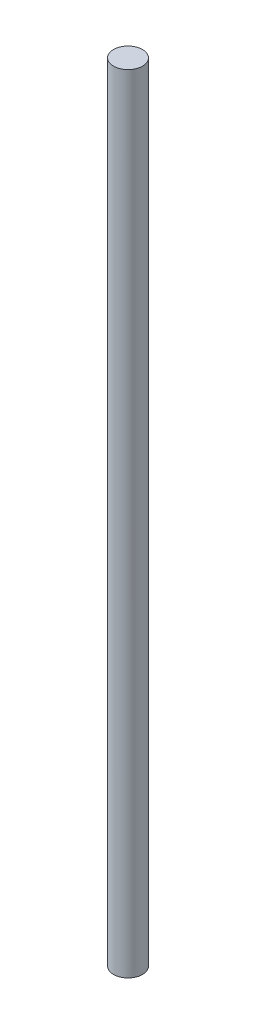
ISO-10303-21;
HEADER;
FILE_DESCRIPTION(('STEP AP214'),'2;1');
FILE_NAME('part.step','',(''),(''),'','','');
FILE_SCHEMA(('AUTOMOTIVE_DESIGN { 1 0 10303 214 1 1 1 1 }'));
ENDSEC;
DATA;
#1=APPLICATION_CONTEXT('core data for automotive mechanical design processes');
#2=APPLICATION_PROTOCOL_DEFINITION('international standard','automotive_design',2000,#1);
#3=PRODUCT_CONTEXT('',#1,'mechanical');
#4=PRODUCT('Part','Part','',(#3));
#5=PRODUCT_RELATED_PRODUCT_CATEGORY('part','',(#4));
#6=PRODUCT_DEFINITION_FORMATION('','',#4);
#7=PRODUCT_DEFINITION_CONTEXT('part definition',#1,'design');
#8=PRODUCT_DEFINITION('design','',#6,#7);
#9=PRODUCT_DEFINITION_SHAPE('','',#8);
#10=(LENGTH_UNIT() NAMED_UNIT(*) SI_UNIT(.MILLI.,.METRE.));
#11=(NAMED_UNIT(*) PLANE_ANGLE_UNIT() SI_UNIT($,.RADIAN.));
#12=(NAMED_UNIT(*) SI_UNIT($,.STERADIAN.) SOLID_ANGLE_UNIT());
#13=UNCERTAINTY_MEASURE_WITH_UNIT(LENGTH_MEASURE(1.E-05),#10,'distance_accuracy_value','');
#14=(GEOMETRIC_REPRESENTATION_CONTEXT(3) GLOBAL_UNCERTAINTY_ASSIGNED_CONTEXT((#13)) GLOBAL_UNIT_ASSIGNED_CONTEXT((#10,
#11,#12)) REPRESENTATION_CONTEXT('',''));
#15=CARTESIAN_POINT('',(0.,0.,0.));
#16=DIRECTION('',(0.,0.,1.));
#17=DIRECTION('',(1.,0.,0.));
#18=AXIS2_PLACEMENT_3D('',#15,#16,#17);
#19=CARTESIAN_POINT('',(0.,50.8,0.));
#20=DIRECTION('',(0.,-1.,0.));
#21=DIRECTION('',(0.,0.,-1.));
#22=AXIS2_PLACEMENT_3D('',#19,#20,#21);
#23=PLANE('',#22);
#24=CARTESIAN_POINT('',(0.,50.8,0.));
#25=DIRECTION('',(0.,-1.,0.));
#26=DIRECTION('',(0.,0.,-1.));
#27=AXIS2_PLACEMENT_3D('',#24,#25,#26);
#28=CIRCLE('',#27,0.927100000000005);
#29=CARTESIAN_POINT('',(0.,50.8,-0.927100000000005));
#30=VERTEX_POINT('',#29);
#31=EDGE_CURVE('E11',#30,#30,#28,.T.);
#32=ORIENTED_EDGE('',*,*,#31,.F.);
#33=EDGE_LOOP('',(#32));
#34=FACE_BOUND('',#33,.T.);
#35=ADVANCED_FACE('F33',(#34),#23,.F.);
#36=CARTESIAN_POINT('',(0.,0.,0.));
#37=DIRECTION('',(0.,-1.,0.));
#38=DIRECTION('',(0.,0.,-1.));
#39=AXIS2_PLACEMENT_3D('',#36,#37,#38);
#40=CYLINDRICAL_SURFACE('',#39,0.927100000000002);
#41=CARTESIAN_POINT('',(0.,0.384017393676101,0.));
#42=DIRECTION('',(0.,-1.,0.));
#43=DIRECTION('',(0.,0.,-1.));
#44=AXIS2_PLACEMENT_3D('',#41,#42,#43);
#45=CIRCLE('',#44,0.927099999999999);
#46=CARTESIAN_POINT('',(0.,0.384017393676101,-0.927099999999999));
#47=VERTEX_POINT('',#46);
#48=EDGE_CURVE('E39',#47,#47,#45,.T.);
#49=ORIENTED_EDGE('',*,*,#48,.F.);
#50=EDGE_LOOP('',(#49));
#51=FACE_BOUND('',#50,.T.);
#52=ORIENTED_EDGE('',*,*,#31,.T.);
#53=EDGE_LOOP('',(#52));
#54=FACE_BOUND('',#53,.T.);
#55=ADVANCED_FACE('F45',(#51,#54),#40,.T.);
#56=CARTESIAN_POINT('',(0.,0.384017393676101,0.));
#57=DIRECTION('',(0.,1.,0.));
#58=DIRECTION('',(0.,0.,1.));
#59=AXIS2_PLACEMENT_3D('',#56,#57,#58);
#60=CONICAL_SURFACE('',#59,0.927099999999999,1.17809724509617);
#61=CARTESIAN_POINT('',(0.,0.,0.));
#62=VERTEX_POINT('',#61);
#63=VERTEX_LOOP('',#62);
#64=FACE_BOUND('',#63,.T.);
#65=ORIENTED_EDGE('',*,*,#48,.T.);
#66=EDGE_LOOP('',(#65));
#67=FACE_BOUND('',#66,.T.);
#68=ADVANCED_FACE('F42',(#64,#67),#60,.T.);
#69=CLOSED_SHELL('',(#35,#55,#68));
#70=MANIFOLD_SOLID_BREP('B2',#69);
#71=ADVANCED_BREP_SHAPE_REPRESENTATION('',(#18,#70),#14);
#72=SHAPE_DEFINITION_REPRESENTATION(#9,#71);
ENDSEC;
END-ISO-10303-21;
